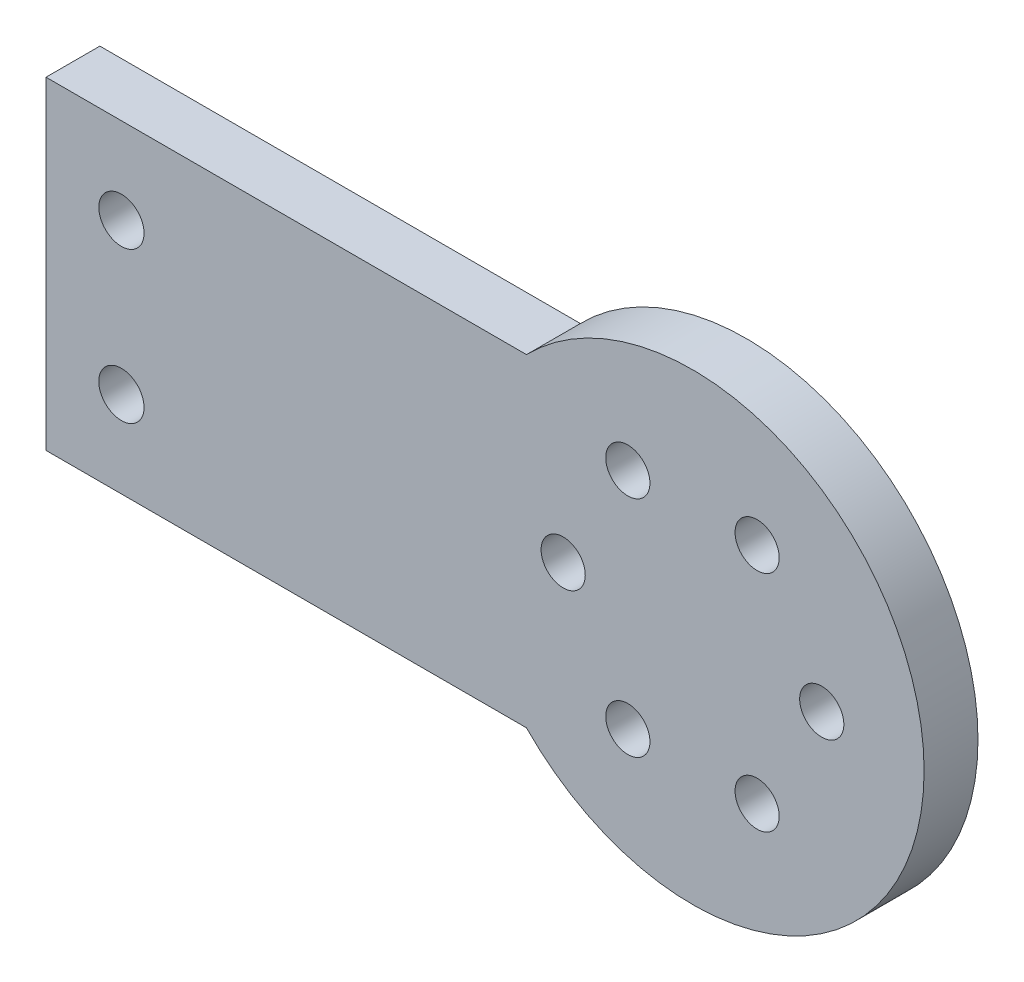
ISO-10303-21;
HEADER;
FILE_DESCRIPTION(('STEP AP214'),'2;1');
FILE_NAME('part.step','',(''),(''),'','','');
FILE_SCHEMA(('AUTOMOTIVE_DESIGN { 1 0 10303 214 1 1 1 1 }'));
ENDSEC;
DATA;
#1=APPLICATION_CONTEXT('core data for automotive mechanical design processes');
#2=APPLICATION_PROTOCOL_DEFINITION('international standard','automotive_design',2000,#1);
#3=PRODUCT_CONTEXT('',#1,'mechanical');
#4=PRODUCT('Part','Part','',(#3));
#5=PRODUCT_RELATED_PRODUCT_CATEGORY('part','',(#4));
#6=PRODUCT_DEFINITION_FORMATION('','',#4);
#7=PRODUCT_DEFINITION_CONTEXT('part definition',#1,'design');
#8=PRODUCT_DEFINITION('design','',#6,#7);
#9=PRODUCT_DEFINITION_SHAPE('','',#8);
#10=(LENGTH_UNIT() NAMED_UNIT(*) SI_UNIT(.MILLI.,.METRE.));
#11=(NAMED_UNIT(*) PLANE_ANGLE_UNIT() SI_UNIT($,.RADIAN.));
#12=(NAMED_UNIT(*) SI_UNIT($,.STERADIAN.) SOLID_ANGLE_UNIT());
#13=UNCERTAINTY_MEASURE_WITH_UNIT(LENGTH_MEASURE(1.E-05),#10,'distance_accuracy_value','');
#14=(GEOMETRIC_REPRESENTATION_CONTEXT(3) GLOBAL_UNCERTAINTY_ASSIGNED_CONTEXT((#13)) GLOBAL_UNIT_ASSIGNED_CONTEXT((#10,
#11,#12)) REPRESENTATION_CONTEXT('',''));
#15=CARTESIAN_POINT('',(0.,0.,0.));
#16=DIRECTION('',(0.,0.,1.));
#17=DIRECTION('',(1.,0.,0.));
#18=AXIS2_PLACEMENT_3D('',#15,#16,#17);
#19=CARTESIAN_POINT('',(0.,0.,-5.));
#20=DIRECTION('',(0.,0.,1.));
#21=DIRECTION('',(-1.,0.,0.));
#22=AXIS2_PLACEMENT_3D('',#19,#20,#21);
#23=PLANE('',#22);
#24=CARTESIAN_POINT('',(-53.,6.99999999999999,-5.));
#25=DIRECTION('',(0.,0.,1.));
#26=DIRECTION('',(1.,0.,0.));
#27=AXIS2_PLACEMENT_3D('',#24,#25,#26);
#28=CIRCLE('',#27,2.1);
#29=CARTESIAN_POINT('',(-50.9,6.99999999999999,-5.));
#30=VERTEX_POINT('',#29);
#31=EDGE_CURVE('E161',#30,#30,#28,.T.);
#32=ORIENTED_EDGE('',*,*,#31,.T.);
#33=EDGE_LOOP('',(#32));
#34=FACE_BOUND('',#33,.T.);
#35=CARTESIAN_POINT('',(-53.,-7.00000000000001,-5.));
#36=DIRECTION('',(0.,0.,1.));
#37=DIRECTION('',(1.,0.,0.));
#38=AXIS2_PLACEMENT_3D('',#35,#36,#37);
#39=CIRCLE('',#38,2.1);
#40=CARTESIAN_POINT('',(-50.9,-7.00000000000001,-5.));
#41=VERTEX_POINT('',#40);
#42=EDGE_CURVE('E158',#41,#41,#39,.T.);
#43=ORIENTED_EDGE('',*,*,#42,.T.);
#44=EDGE_LOOP('',(#43));
#45=FACE_BOUND('',#44,.T.);
#46=CARTESIAN_POINT('',(0.,0.,-5.));
#47=DIRECTION('',(0.,0.,1.));
#48=DIRECTION('',(-1.,0.,0.));
#49=AXIS2_PLACEMENT_3D('',#46,#47,#48);
#50=CIRCLE('',#49,21.5);
#51=CARTESIAN_POINT('',(-15.4029218007493,-15.,-5.));
#52=VERTEX_POINT('',#51);
#53=CARTESIAN_POINT('',(-15.4029218007494,15.,-5.));
#54=VERTEX_POINT('',#53);
#55=EDGE_CURVE('E99',#52,#54,#50,.T.);
#56=ORIENTED_EDGE('',*,*,#55,.F.);
#57=DIRECTION('',(1.,0.,0.));
#58=VECTOR('',#57,1.);
#59=CARTESIAN_POINT('',(-60.,-15.,-5.));
#60=LINE('',#59,#58);
#61=CARTESIAN_POINT('',(-60.,-15.,-5.));
#62=VERTEX_POINT('',#61);
#63=EDGE_CURVE('E102',#62,#52,#60,.T.);
#64=ORIENTED_EDGE('',*,*,#63,.F.);
#65=DIRECTION('',(0.,-1.,0.));
#66=VECTOR('',#65,1.);
#67=CARTESIAN_POINT('',(-60.,0.,-5.));
#68=LINE('',#67,#66);
#69=CARTESIAN_POINT('',(-60.,15.,-5.));
#70=VERTEX_POINT('',#69);
#71=EDGE_CURVE('E90',#70,#62,#68,.T.);
#72=ORIENTED_EDGE('',*,*,#71,.F.);
#73=DIRECTION('',(-1.,0.,0.));
#74=VECTOR('',#73,1.);
#75=CARTESIAN_POINT('',(-60.,15.,-5.));
#76=LINE('',#75,#74);
#77=EDGE_CURVE('E95',#54,#70,#76,.T.);
#78=ORIENTED_EDGE('',*,*,#77,.F.);
#79=EDGE_LOOP('',(#56,#64,#72,#78));
#80=FACE_BOUND('',#79,.T.);
#81=CARTESIAN_POINT('',(12.,0.,-5.));
#82=DIRECTION('',(0.,0.,1.));
#83=DIRECTION('',(1.,0.,0.));
#84=AXIS2_PLACEMENT_3D('',#81,#82,#83);
#85=CIRCLE('',#84,2.05);
#86=CARTESIAN_POINT('',(14.05,0.,-5.));
#87=VERTEX_POINT('',#86);
#88=EDGE_CURVE('E111',#87,#87,#85,.T.);
#89=ORIENTED_EDGE('',*,*,#88,.T.);
#90=EDGE_LOOP('',(#89));
#91=FACE_BOUND('',#90,.T.);
#92=CARTESIAN_POINT('',(5.99999999999998,-10.3923048454133,-5.));
#93=DIRECTION('',(0.,0.,1.));
#94=DIRECTION('',(1.,0.,0.));
#95=AXIS2_PLACEMENT_3D('',#92,#93,#94);
#96=CIRCLE('',#95,2.05);
#97=CARTESIAN_POINT('',(8.04999999999998,-10.3923048454133,-5.));
#98=VERTEX_POINT('',#97);
#99=EDGE_CURVE('E122',#98,#98,#96,.T.);
#100=ORIENTED_EDGE('',*,*,#99,.T.);
#101=EDGE_LOOP('',(#100));
#102=FACE_BOUND('',#101,.T.);
#103=CARTESIAN_POINT('',(-6.00000000000005,-10.3923048454132,-5.));
#104=DIRECTION('',(0.,0.,1.));
#105=DIRECTION('',(1.,0.,0.));
#106=AXIS2_PLACEMENT_3D('',#103,#104,#105);
#107=CIRCLE('',#106,2.05);
#108=CARTESIAN_POINT('',(-3.95000000000005,-10.3923048454132,-5.));
#109=VERTEX_POINT('',#108);
#110=EDGE_CURVE('E128',#109,#109,#107,.T.);
#111=ORIENTED_EDGE('',*,*,#110,.T.);
#112=EDGE_LOOP('',(#111));
#113=FACE_BOUND('',#112,.T.);
#114=CARTESIAN_POINT('',(-12.,0.,-5.));
#115=DIRECTION('',(0.,0.,1.));
#116=DIRECTION('',(1.,0.,0.));
#117=AXIS2_PLACEMENT_3D('',#114,#115,#116);
#118=CIRCLE('',#117,2.05);
#119=CARTESIAN_POINT('',(-9.95,0.,-5.));
#120=VERTEX_POINT('',#119);
#121=EDGE_CURVE('E134',#120,#120,#118,.T.);
#122=ORIENTED_EDGE('',*,*,#121,.T.);
#123=EDGE_LOOP('',(#122));
#124=FACE_BOUND('',#123,.T.);
#125=CARTESIAN_POINT('',(-5.9999999999999,10.3923048454133,-5.));
#126=DIRECTION('',(0.,0.,1.));
#127=DIRECTION('',(1.,0.,0.));
#128=AXIS2_PLACEMENT_3D('',#125,#126,#127);
#129=CIRCLE('',#128,2.05);
#130=CARTESIAN_POINT('',(-3.94999999999991,10.3923048454133,-5.));
#131=VERTEX_POINT('',#130);
#132=EDGE_CURVE('E140',#131,#131,#129,.T.);
#133=ORIENTED_EDGE('',*,*,#132,.T.);
#134=EDGE_LOOP('',(#133));
#135=FACE_BOUND('',#134,.T.);
#136=CARTESIAN_POINT('',(6.00000000000012,10.3923048454132,-5.));
#137=DIRECTION('',(0.,0.,1.));
#138=DIRECTION('',(1.,0.,0.));
#139=AXIS2_PLACEMENT_3D('',#136,#137,#138);
#140=CIRCLE('',#139,2.05);
#141=CARTESIAN_POINT('',(8.05000000000012,10.3923048454132,-5.));
#142=VERTEX_POINT('',#141);
#143=EDGE_CURVE('E146',#142,#142,#140,.T.);
#144=ORIENTED_EDGE('',*,*,#143,.T.);
#145=EDGE_LOOP('',(#144));
#146=FACE_BOUND('',#145,.T.);
#147=ADVANCED_FACE('F43',(#34,#45,#80,#91,#102,#113,#124,#135,#146),#23,.F.);
#148=CARTESIAN_POINT('',(0.,0.,0.));
#149=DIRECTION('',(0.,0.,1.));
#150=DIRECTION('',(-1.,0.,0.));
#151=AXIS2_PLACEMENT_3D('',#148,#149,#150);
#152=PLANE('',#151);
#153=CARTESIAN_POINT('',(-53.,6.99999999999999,0.));
#154=DIRECTION('',(0.,0.,1.));
#155=DIRECTION('',(1.,0.,0.));
#156=AXIS2_PLACEMENT_3D('',#153,#154,#155);
#157=CIRCLE('',#156,2.1);
#158=CARTESIAN_POINT('',(-50.9,6.99999999999999,0.));
#159=VERTEX_POINT('',#158);
#160=EDGE_CURVE('E152',#159,#159,#157,.T.);
#161=ORIENTED_EDGE('',*,*,#160,.F.);
#162=EDGE_LOOP('',(#161));
#163=FACE_BOUND('',#162,.T.);
#164=CARTESIAN_POINT('',(-53.,-7.00000000000001,0.));
#165=DIRECTION('',(0.,0.,1.));
#166=DIRECTION('',(1.,0.,0.));
#167=AXIS2_PLACEMENT_3D('',#164,#165,#166);
#168=CIRCLE('',#167,2.1);
#169=CARTESIAN_POINT('',(-50.9,-7.00000000000001,0.));
#170=VERTEX_POINT('',#169);
#171=EDGE_CURVE('E155',#170,#170,#168,.T.);
#172=ORIENTED_EDGE('',*,*,#171,.F.);
#173=EDGE_LOOP('',(#172));
#174=FACE_BOUND('',#173,.T.);
#175=CARTESIAN_POINT('',(-5.9999999999999,10.3923048454133,0.));
#176=DIRECTION('',(0.,0.,1.));
#177=DIRECTION('',(1.,0.,0.));
#178=AXIS2_PLACEMENT_3D('',#175,#176,#177);
#179=CIRCLE('',#178,2.05);
#180=CARTESIAN_POINT('',(-3.94999999999991,10.3923048454133,0.));
#181=VERTEX_POINT('',#180);
#182=EDGE_CURVE('E143',#181,#181,#179,.T.);
#183=ORIENTED_EDGE('',*,*,#182,.F.);
#184=EDGE_LOOP('',(#183));
#185=FACE_BOUND('',#184,.T.);
#186=CARTESIAN_POINT('',(-6.00000000000005,-10.3923048454132,0.));
#187=DIRECTION('',(0.,0.,1.));
#188=DIRECTION('',(1.,0.,0.));
#189=AXIS2_PLACEMENT_3D('',#186,#187,#188);
#190=CIRCLE('',#189,2.05);
#191=CARTESIAN_POINT('',(-3.95000000000005,-10.3923048454132,0.));
#192=VERTEX_POINT('',#191);
#193=EDGE_CURVE('E131',#192,#192,#190,.T.);
#194=ORIENTED_EDGE('',*,*,#193,.F.);
#195=EDGE_LOOP('',(#194));
#196=FACE_BOUND('',#195,.T.);
#197=CARTESIAN_POINT('',(12.,0.,0.));
#198=DIRECTION('',(0.,0.,1.));
#199=DIRECTION('',(1.,0.,0.));
#200=AXIS2_PLACEMENT_3D('',#197,#198,#199);
#201=CIRCLE('',#200,2.05);
#202=CARTESIAN_POINT('',(14.05,0.,0.));
#203=VERTEX_POINT('',#202);
#204=EDGE_CURVE('E119',#203,#203,#201,.T.);
#205=ORIENTED_EDGE('',*,*,#204,.F.);
#206=EDGE_LOOP('',(#205));
#207=FACE_BOUND('',#206,.T.);
#208=CARTESIAN_POINT('',(0.,0.,0.));
#209=DIRECTION('',(0.,0.,1.));
#210=DIRECTION('',(-1.,0.,0.));
#211=AXIS2_PLACEMENT_3D('',#208,#209,#210);
#212=CIRCLE('',#211,21.5);
#213=CARTESIAN_POINT('',(-15.4029218007493,-15.,0.));
#214=VERTEX_POINT('',#213);
#215=CARTESIAN_POINT('',(-15.4029218007494,15.,0.));
#216=VERTEX_POINT('',#215);
#217=EDGE_CURVE('E107',#214,#216,#212,.T.);
#218=ORIENTED_EDGE('',*,*,#217,.T.);
#219=DIRECTION('',(-1.,0.,0.));
#220=VECTOR('',#219,1.);
#221=CARTESIAN_POINT('',(-60.,15.,0.));
#222=LINE('',#221,#220);
#223=CARTESIAN_POINT('',(-60.,15.,0.));
#224=VERTEX_POINT('',#223);
#225=EDGE_CURVE('E110',#216,#224,#222,.T.);
#226=ORIENTED_EDGE('',*,*,#225,.T.);
#227=DIRECTION('',(0.,-1.,0.));
#228=VECTOR('',#227,1.);
#229=CARTESIAN_POINT('',(-60.,0.,0.));
#230=LINE('',#229,#228);
#231=CARTESIAN_POINT('',(-60.,-15.,0.));
#232=VERTEX_POINT('',#231);
#233=EDGE_CURVE('E93',#224,#232,#230,.T.);
#234=ORIENTED_EDGE('',*,*,#233,.T.);
#235=DIRECTION('',(1.,0.,0.));
#236=VECTOR('',#235,1.);
#237=CARTESIAN_POINT('',(-60.,-15.,0.));
#238=LINE('',#237,#236);
#239=EDGE_CURVE('E114',#232,#214,#238,.T.);
#240=ORIENTED_EDGE('',*,*,#239,.T.);
#241=EDGE_LOOP('',(#218,#226,#234,#240));
#242=FACE_BOUND('',#241,.T.);
#243=CARTESIAN_POINT('',(5.99999999999998,-10.3923048454133,0.));
#244=DIRECTION('',(0.,0.,1.));
#245=DIRECTION('',(1.,0.,0.));
#246=AXIS2_PLACEMENT_3D('',#243,#244,#245);
#247=CIRCLE('',#246,2.05);
#248=CARTESIAN_POINT('',(8.04999999999998,-10.3923048454133,0.));
#249=VERTEX_POINT('',#248);
#250=EDGE_CURVE('E125',#249,#249,#247,.T.);
#251=ORIENTED_EDGE('',*,*,#250,.F.);
#252=EDGE_LOOP('',(#251));
#253=FACE_BOUND('',#252,.T.);
#254=CARTESIAN_POINT('',(-12.,0.,0.));
#255=DIRECTION('',(0.,0.,1.));
#256=DIRECTION('',(1.,0.,0.));
#257=AXIS2_PLACEMENT_3D('',#254,#255,#256);
#258=CIRCLE('',#257,2.05);
#259=CARTESIAN_POINT('',(-9.95,0.,0.));
#260=VERTEX_POINT('',#259);
#261=EDGE_CURVE('E137',#260,#260,#258,.T.);
#262=ORIENTED_EDGE('',*,*,#261,.F.);
#263=EDGE_LOOP('',(#262));
#264=FACE_BOUND('',#263,.T.);
#265=CARTESIAN_POINT('',(6.00000000000012,10.3923048454132,0.));
#266=DIRECTION('',(0.,0.,1.));
#267=DIRECTION('',(1.,0.,0.));
#268=AXIS2_PLACEMENT_3D('',#265,#266,#267);
#269=CIRCLE('',#268,2.05);
#270=CARTESIAN_POINT('',(8.05000000000012,10.3923048454132,0.));
#271=VERTEX_POINT('',#270);
#272=EDGE_CURVE('E149',#271,#271,#269,.T.);
#273=ORIENTED_EDGE('',*,*,#272,.F.);
#274=EDGE_LOOP('',(#273));
#275=FACE_BOUND('',#274,.T.);
#276=ADVANCED_FACE('F170',(#163,#174,#185,#196,#207,#242,#253,#264,#275),#152,.T.);
#277=CARTESIAN_POINT('',(0.,0.,-5.));
#278=DIRECTION('',(0.,0.,1.));
#279=DIRECTION('',(-1.,0.,0.));
#280=AXIS2_PLACEMENT_3D('',#277,#278,#279);
#281=CYLINDRICAL_SURFACE('',#280,21.5);
#282=ORIENTED_EDGE('',*,*,#217,.F.);
#283=DIRECTION('',(0.,0.,1.));
#284=VECTOR('',#283,1.);
#285=CARTESIAN_POINT('',(-15.4029218007493,-15.,-5.));
#286=LINE('',#285,#284);
#287=EDGE_CURVE('E60',#52,#214,#286,.T.);
#288=ORIENTED_EDGE('',*,*,#287,.F.);
#289=ORIENTED_EDGE('',*,*,#55,.T.);
#290=DIRECTION('',(0.,0.,1.));
#291=VECTOR('',#290,1.);
#292=CARTESIAN_POINT('',(-15.4029218007494,15.,-5.));
#293=LINE('',#292,#291);
#294=EDGE_CURVE('E11',#54,#216,#293,.T.);
#295=ORIENTED_EDGE('',*,*,#294,.T.);
#296=EDGE_LOOP('',(#282,#288,#289,#295));
#297=FACE_BOUND('',#296,.T.);
#298=ADVANCED_FACE('F45',(#297),#281,.T.);
#299=CARTESIAN_POINT('',(-60.,15.,-5.));
#300=DIRECTION('',(0.,-1.,0.));
#301=DIRECTION('',(1.,0.,0.));
#302=AXIS2_PLACEMENT_3D('',#299,#300,#301);
#303=PLANE('',#302);
#304=ORIENTED_EDGE('',*,*,#225,.F.);
#305=ORIENTED_EDGE('',*,*,#294,.F.);
#306=ORIENTED_EDGE('',*,*,#77,.T.);
#307=DIRECTION('',(0.,0.,1.));
#308=VECTOR('',#307,1.);
#309=CARTESIAN_POINT('',(-60.,15.,-5.));
#310=LINE('',#309,#308);
#311=EDGE_CURVE('E52',#70,#224,#310,.T.);
#312=ORIENTED_EDGE('',*,*,#311,.T.);
#313=EDGE_LOOP('',(#304,#305,#306,#312));
#314=FACE_BOUND('',#313,.T.);
#315=ADVANCED_FACE('F96',(#314),#303,.F.);
#316=CARTESIAN_POINT('',(-60.,0.,-5.));
#317=DIRECTION('',(1.,0.,0.));
#318=DIRECTION('',(0.,0.,1.));
#319=AXIS2_PLACEMENT_3D('',#316,#317,#318);
#320=PLANE('',#319);
#321=ORIENTED_EDGE('',*,*,#233,.F.);
#322=ORIENTED_EDGE('',*,*,#311,.F.);
#323=ORIENTED_EDGE('',*,*,#71,.T.);
#324=DIRECTION('',(0.,0.,1.));
#325=VECTOR('',#324,1.);
#326=CARTESIAN_POINT('',(-60.,-15.,-5.));
#327=LINE('',#326,#325);
#328=EDGE_CURVE('E76',#62,#232,#327,.T.);
#329=ORIENTED_EDGE('',*,*,#328,.T.);
#330=EDGE_LOOP('',(#321,#322,#323,#329));
#331=FACE_BOUND('',#330,.T.);
#332=ADVANCED_FACE('F88',(#331),#320,.F.);
#333=CARTESIAN_POINT('',(-60.,-15.,-5.));
#334=DIRECTION('',(0.,1.,0.));
#335=DIRECTION('',(-1.,0.,0.));
#336=AXIS2_PLACEMENT_3D('',#333,#334,#335);
#337=PLANE('',#336);
#338=ORIENTED_EDGE('',*,*,#239,.F.);
#339=ORIENTED_EDGE('',*,*,#328,.F.);
#340=ORIENTED_EDGE('',*,*,#63,.T.);
#341=ORIENTED_EDGE('',*,*,#287,.T.);
#342=EDGE_LOOP('',(#338,#339,#340,#341));
#343=FACE_BOUND('',#342,.T.);
#344=ADVANCED_FACE('F214',(#343),#337,.F.);
#345=CARTESIAN_POINT('',(12.,0.,-5.));
#346=DIRECTION('',(0.,0.,1.));
#347=DIRECTION('',(-1.,0.,0.));
#348=AXIS2_PLACEMENT_3D('',#345,#346,#347);
#349=CYLINDRICAL_SURFACE('',#348,2.05);
#350=ORIENTED_EDGE('',*,*,#88,.F.);
#351=EDGE_LOOP('',(#350));
#352=FACE_BOUND('',#351,.T.);
#353=ORIENTED_EDGE('',*,*,#204,.T.);
#354=EDGE_LOOP('',(#353));
#355=FACE_BOUND('',#354,.T.);
#356=ADVANCED_FACE('F211',(#352,#355),#349,.F.);
#357=CARTESIAN_POINT('',(5.99999999999998,-10.3923048454133,-5.));
#358=DIRECTION('',(0.,0.,1.));
#359=DIRECTION('',(-1.,0.,0.));
#360=AXIS2_PLACEMENT_3D('',#357,#358,#359);
#361=CYLINDRICAL_SURFACE('',#360,2.05);
#362=ORIENTED_EDGE('',*,*,#99,.F.);
#363=EDGE_LOOP('',(#362));
#364=FACE_BOUND('',#363,.T.);
#365=ORIENTED_EDGE('',*,*,#250,.T.);
#366=EDGE_LOOP('',(#365));
#367=FACE_BOUND('',#366,.T.);
#368=ADVANCED_FACE('F270',(#364,#367),#361,.F.);
#369=CARTESIAN_POINT('',(-6.00000000000005,-10.3923048454132,-5.));
#370=DIRECTION('',(0.,0.,1.));
#371=DIRECTION('',(-1.,0.,0.));
#372=AXIS2_PLACEMENT_3D('',#369,#370,#371);
#373=CYLINDRICAL_SURFACE('',#372,2.05);
#374=ORIENTED_EDGE('',*,*,#110,.F.);
#375=EDGE_LOOP('',(#374));
#376=FACE_BOUND('',#375,.T.);
#377=ORIENTED_EDGE('',*,*,#193,.T.);
#378=EDGE_LOOP('',(#377));
#379=FACE_BOUND('',#378,.T.);
#380=ADVANCED_FACE('F261',(#376,#379),#373,.F.);
#381=CARTESIAN_POINT('',(-12.,0.,-5.));
#382=DIRECTION('',(0.,0.,1.));
#383=DIRECTION('',(-1.,0.,0.));
#384=AXIS2_PLACEMENT_3D('',#381,#382,#383);
#385=CYLINDRICAL_SURFACE('',#384,2.05);
#386=ORIENTED_EDGE('',*,*,#121,.F.);
#387=EDGE_LOOP('',(#386));
#388=FACE_BOUND('',#387,.T.);
#389=ORIENTED_EDGE('',*,*,#261,.T.);
#390=EDGE_LOOP('',(#389));
#391=FACE_BOUND('',#390,.T.);
#392=ADVANCED_FACE('F200',(#388,#391),#385,.F.);
#393=CARTESIAN_POINT('',(-5.9999999999999,10.3923048454133,-5.));
#394=DIRECTION('',(0.,0.,1.));
#395=DIRECTION('',(-1.,0.,0.));
#396=AXIS2_PLACEMENT_3D('',#393,#394,#395);
#397=CYLINDRICAL_SURFACE('',#396,2.05);
#398=ORIENTED_EDGE('',*,*,#132,.F.);
#399=EDGE_LOOP('',(#398));
#400=FACE_BOUND('',#399,.T.);
#401=ORIENTED_EDGE('',*,*,#182,.T.);
#402=EDGE_LOOP('',(#401));
#403=FACE_BOUND('',#402,.T.);
#404=ADVANCED_FACE('F191',(#400,#403),#397,.F.);
#405=CARTESIAN_POINT('',(6.00000000000012,10.3923048454132,-5.));
#406=DIRECTION('',(0.,0.,1.));
#407=DIRECTION('',(-1.,0.,0.));
#408=AXIS2_PLACEMENT_3D('',#405,#406,#407);
#409=CYLINDRICAL_SURFACE('',#408,2.05);
#410=ORIENTED_EDGE('',*,*,#143,.F.);
#411=EDGE_LOOP('',(#410));
#412=FACE_BOUND('',#411,.T.);
#413=ORIENTED_EDGE('',*,*,#272,.T.);
#414=EDGE_LOOP('',(#413));
#415=FACE_BOUND('',#414,.T.);
#416=ADVANCED_FACE('F188',(#412,#415),#409,.F.);
#417=CARTESIAN_POINT('',(-53.,-7.00000000000001,0.));
#418=DIRECTION('',(0.,0.,-1.));
#419=DIRECTION('',(1.,0.,0.));
#420=AXIS2_PLACEMENT_3D('',#417,#418,#419);
#421=CYLINDRICAL_SURFACE('',#420,2.1);
#422=ORIENTED_EDGE('',*,*,#171,.T.);
#423=EDGE_LOOP('',(#422));
#424=FACE_BOUND('',#423,.T.);
#425=ORIENTED_EDGE('',*,*,#42,.F.);
#426=EDGE_LOOP('',(#425));
#427=FACE_BOUND('',#426,.T.);
#428=ADVANCED_FACE('F190',(#424,#427),#421,.F.);
#429=CARTESIAN_POINT('',(-53.,6.99999999999999,0.));
#430=DIRECTION('',(0.,0.,-1.));
#431=DIRECTION('',(1.,0.,0.));
#432=AXIS2_PLACEMENT_3D('',#429,#430,#431);
#433=CYLINDRICAL_SURFACE('',#432,2.1);
#434=ORIENTED_EDGE('',*,*,#160,.T.);
#435=EDGE_LOOP('',(#434));
#436=FACE_BOUND('',#435,.T.);
#437=ORIENTED_EDGE('',*,*,#31,.F.);
#438=EDGE_LOOP('',(#437));
#439=FACE_BOUND('',#438,.T.);
#440=ADVANCED_FACE('F167',(#436,#439),#433,.F.);
#441=CLOSED_SHELL('',(#147,#276,#298,#315,#332,#344,#356,#368,#380,#392,#404,#416,#428,#440));
#442=MANIFOLD_SOLID_BREP('B2',#441);
#443=ADVANCED_BREP_SHAPE_REPRESENTATION('',(#18,#442),#14);
#444=SHAPE_DEFINITION_REPRESENTATION(#9,#443);
ENDSEC;
END-ISO-10303-21;
